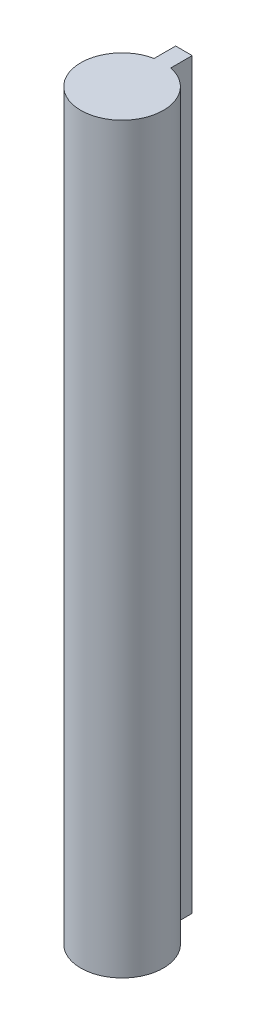
ISO-10303-21;
HEADER;
FILE_DESCRIPTION(('STEP AP214'),'2;1');
FILE_NAME('part.step','',(''),(''),'','','');
FILE_SCHEMA(('AUTOMOTIVE_DESIGN { 1 0 10303 214 1 1 1 1 }'));
ENDSEC;
DATA;
#1=APPLICATION_CONTEXT('core data for automotive mechanical design processes');
#2=APPLICATION_PROTOCOL_DEFINITION('international standard','automotive_design',2000,#1);
#3=PRODUCT_CONTEXT('',#1,'mechanical');
#4=PRODUCT('Part','Part','',(#3));
#5=PRODUCT_RELATED_PRODUCT_CATEGORY('part','',(#4));
#6=PRODUCT_DEFINITION_FORMATION('','',#4);
#7=PRODUCT_DEFINITION_CONTEXT('part definition',#1,'design');
#8=PRODUCT_DEFINITION('design','',#6,#7);
#9=PRODUCT_DEFINITION_SHAPE('','',#8);
#10=(LENGTH_UNIT() NAMED_UNIT(*) SI_UNIT(.MILLI.,.METRE.));
#11=(NAMED_UNIT(*) PLANE_ANGLE_UNIT() SI_UNIT($,.RADIAN.));
#12=(NAMED_UNIT(*) SI_UNIT($,.STERADIAN.) SOLID_ANGLE_UNIT());
#13=UNCERTAINTY_MEASURE_WITH_UNIT(LENGTH_MEASURE(1.E-05),#10,'distance_accuracy_value','');
#14=(GEOMETRIC_REPRESENTATION_CONTEXT(3) GLOBAL_UNCERTAINTY_ASSIGNED_CONTEXT((#13)) GLOBAL_UNIT_ASSIGNED_CONTEXT((#10,
#11,#12)) REPRESENTATION_CONTEXT('',''));
#15=CARTESIAN_POINT('',(0.,0.,0.));
#16=DIRECTION('',(0.,0.,1.));
#17=DIRECTION('',(1.,0.,0.));
#18=AXIS2_PLACEMENT_3D('',#15,#16,#17);
#19=CARTESIAN_POINT('',(0.,-8.00000000000001,0.));
#20=DIRECTION('',(0.,1.,0.));
#21=DIRECTION('',(0.,0.,1.));
#22=AXIS2_PLACEMENT_3D('',#19,#20,#21);
#23=CYLINDRICAL_SURFACE('',#22,1.);
#24=DIRECTION('',(0.,1.,0.));
#25=VECTOR('',#24,1.);
#26=CARTESIAN_POINT('',(0.2,-8.00000000000001,-0.979795897113271));
#27=LINE('',#26,#25);
#28=CARTESIAN_POINT('',(0.2,0.,-0.979795897113271));
#29=VERTEX_POINT('',#28);
#30=CARTESIAN_POINT('',(0.2,18.,-0.979795897113271));
#31=VERTEX_POINT('',#30);
#32=EDGE_CURVE('E88',#29,#31,#27,.T.);
#33=ORIENTED_EDGE('',*,*,#32,.T.);
#34=CARTESIAN_POINT('',(0.,18.,0.));
#35=DIRECTION('',(0.,1.,0.));
#36=DIRECTION('',(0.,0.,1.));
#37=AXIS2_PLACEMENT_3D('',#34,#35,#36);
#38=CIRCLE('',#37,1.);
#39=CARTESIAN_POINT('',(-0.201515180428601,18.,-0.97948539144636));
#40=VERTEX_POINT('',#39);
#41=EDGE_CURVE('E79',#31,#40,#38,.F.);
#42=ORIENTED_EDGE('',*,*,#41,.T.);
#43=DIRECTION('',(0.,1.,0.));
#44=VECTOR('',#43,1.);
#45=CARTESIAN_POINT('',(-0.201515180428601,-8.00000000000001,-0.97948539144636));
#46=LINE('',#45,#44);
#47=CARTESIAN_POINT('',(-0.201515180428601,0.,-0.97948539144636));
#48=VERTEX_POINT('',#47);
#49=EDGE_CURVE('E85',#48,#40,#46,.T.);
#50=ORIENTED_EDGE('',*,*,#49,.F.);
#51=CARTESIAN_POINT('',(0.,0.,0.));
#52=DIRECTION('',(0.,1.,0.));
#53=DIRECTION('',(0.,0.,1.));
#54=AXIS2_PLACEMENT_3D('',#51,#52,#53);
#55=CIRCLE('',#54,1.);
#56=EDGE_CURVE('E48',#48,#29,#55,.T.);
#57=ORIENTED_EDGE('',*,*,#56,.T.);
#58=EDGE_LOOP('',(#33,#42,#50,#57));
#59=FACE_BOUND('',#58,.T.);
#60=ADVANCED_FACE('F40',(#59),#23,.T.);
#61=CARTESIAN_POINT('',(0.2,-8.00000000000001,0.));
#62=DIRECTION('',(-1.,0.,0.));
#63=DIRECTION('',(0.,0.,1.));
#64=AXIS2_PLACEMENT_3D('',#61,#62,#63);
#65=PLANE('',#64);
#66=DIRECTION('',(0.,0.,-1.));
#67=VECTOR('',#66,1.);
#68=CARTESIAN_POINT('',(0.2,18.,0.));
#69=LINE('',#68,#67);
#70=CARTESIAN_POINT('',(0.2,18.,-1.5));
#71=VERTEX_POINT('',#70);
#72=EDGE_CURVE('E89',#31,#71,#69,.T.);
#73=ORIENTED_EDGE('',*,*,#72,.F.);
#74=ORIENTED_EDGE('',*,*,#32,.F.);
#75=DIRECTION('',(0.,0.,1.));
#76=VECTOR('',#75,1.);
#77=CARTESIAN_POINT('',(0.2,0.,0.));
#78=LINE('',#77,#76);
#79=CARTESIAN_POINT('',(0.2,0.,-1.5));
#80=VERTEX_POINT('',#79);
#81=EDGE_CURVE('E103',#80,#29,#78,.T.);
#82=ORIENTED_EDGE('',*,*,#81,.F.);
#83=DIRECTION('',(0.,1.,0.));
#84=VECTOR('',#83,1.);
#85=CARTESIAN_POINT('',(0.2,-8.00000000000001,-1.5));
#86=LINE('',#85,#84);
#87=EDGE_CURVE('E95',#80,#71,#86,.T.);
#88=ORIENTED_EDGE('',*,*,#87,.T.);
#89=EDGE_LOOP('',(#73,#74,#82,#88));
#90=FACE_BOUND('',#89,.T.);
#91=ADVANCED_FACE('F107',(#90),#65,.F.);
#92=CARTESIAN_POINT('',(0.,-8.00000000000001,-1.5));
#93=DIRECTION('',(0.,0.,1.));
#94=DIRECTION('',(1.,0.,0.));
#95=AXIS2_PLACEMENT_3D('',#92,#93,#94);
#96=PLANE('',#95);
#97=DIRECTION('',(-1.,0.,0.));
#98=VECTOR('',#97,1.);
#99=CARTESIAN_POINT('',(0.,18.,-1.5));
#100=LINE('',#99,#98);
#101=CARTESIAN_POINT('',(-0.201515180428601,18.,-1.5));
#102=VERTEX_POINT('',#101);
#103=EDGE_CURVE('E55',#71,#102,#100,.T.);
#104=ORIENTED_EDGE('',*,*,#103,.F.);
#105=ORIENTED_EDGE('',*,*,#87,.F.);
#106=DIRECTION('',(1.,0.,0.));
#107=VECTOR('',#106,1.);
#108=CARTESIAN_POINT('',(0.,0.,-1.5));
#109=LINE('',#108,#107);
#110=CARTESIAN_POINT('',(-0.201515180428601,0.,-1.5));
#111=VERTEX_POINT('',#110);
#112=EDGE_CURVE('E100',#111,#80,#109,.T.);
#113=ORIENTED_EDGE('',*,*,#112,.F.);
#114=DIRECTION('',(0.,1.,0.));
#115=VECTOR('',#114,1.);
#116=CARTESIAN_POINT('',(-0.201515180428601,-8.00000000000001,-1.5));
#117=LINE('',#116,#115);
#118=EDGE_CURVE('E61',#111,#102,#117,.T.);
#119=ORIENTED_EDGE('',*,*,#118,.T.);
#120=EDGE_LOOP('',(#104,#105,#113,#119));
#121=FACE_BOUND('',#120,.T.);
#122=ADVANCED_FACE('F112',(#121),#96,.F.);
#123=CARTESIAN_POINT('',(-0.201515180428601,-8.00000000000001,0.));
#124=DIRECTION('',(-1.,0.,0.));
#125=DIRECTION('',(0.,0.,1.));
#126=AXIS2_PLACEMENT_3D('',#123,#124,#125);
#127=PLANE('',#126);
#128=ORIENTED_EDGE('',*,*,#49,.T.);
#129=DIRECTION('',(0.,0.,-1.));
#130=VECTOR('',#129,1.);
#131=CARTESIAN_POINT('',(-0.201515180428601,18.,0.));
#132=LINE('',#131,#130);
#133=EDGE_CURVE('E11',#40,#102,#132,.T.);
#134=ORIENTED_EDGE('',*,*,#133,.T.);
#135=ORIENTED_EDGE('',*,*,#118,.F.);
#136=DIRECTION('',(0.,0.,1.));
#137=VECTOR('',#136,1.);
#138=CARTESIAN_POINT('',(-0.201515180428601,0.,0.));
#139=LINE('',#138,#137);
#140=EDGE_CURVE('E93',#111,#48,#139,.T.);
#141=ORIENTED_EDGE('',*,*,#140,.T.);
#142=EDGE_LOOP('',(#128,#134,#135,#141));
#143=FACE_BOUND('',#142,.T.);
#144=ADVANCED_FACE('F91',(#143),#127,.T.);
#145=CARTESIAN_POINT('',(0.,0.,0.));
#146=DIRECTION('',(0.,1.,0.));
#147=DIRECTION('',(0.,0.,1.));
#148=AXIS2_PLACEMENT_3D('',#145,#146,#147);
#149=PLANE('',#148);
#150=ORIENTED_EDGE('',*,*,#56,.F.);
#151=ORIENTED_EDGE('',*,*,#140,.F.);
#152=ORIENTED_EDGE('',*,*,#112,.T.);
#153=ORIENTED_EDGE('',*,*,#81,.T.);
#154=EDGE_LOOP('',(#150,#151,#152,#153));
#155=FACE_BOUND('',#154,.T.);
#156=ADVANCED_FACE('F42',(#155),#149,.F.);
#157=CARTESIAN_POINT('',(0.,18.,0.));
#158=DIRECTION('',(0.,1.,0.));
#159=DIRECTION('',(0.,0.,1.));
#160=AXIS2_PLACEMENT_3D('',#157,#158,#159);
#161=PLANE('',#160);
#162=ORIENTED_EDGE('',*,*,#72,.T.);
#163=ORIENTED_EDGE('',*,*,#103,.T.);
#164=ORIENTED_EDGE('',*,*,#133,.F.);
#165=ORIENTED_EDGE('',*,*,#41,.F.);
#166=EDGE_LOOP('',(#162,#163,#164,#165));
#167=FACE_BOUND('',#166,.T.);
#168=ADVANCED_FACE('F78',(#167),#161,.T.);
#169=CLOSED_SHELL('',(#60,#91,#122,#144,#156,#168));
#170=MANIFOLD_SOLID_BREP('B2',#169);
#171=ADVANCED_BREP_SHAPE_REPRESENTATION('',(#18,#170),#14);
#172=SHAPE_DEFINITION_REPRESENTATION(#9,#171);
ENDSEC;
END-ISO-10303-21;
